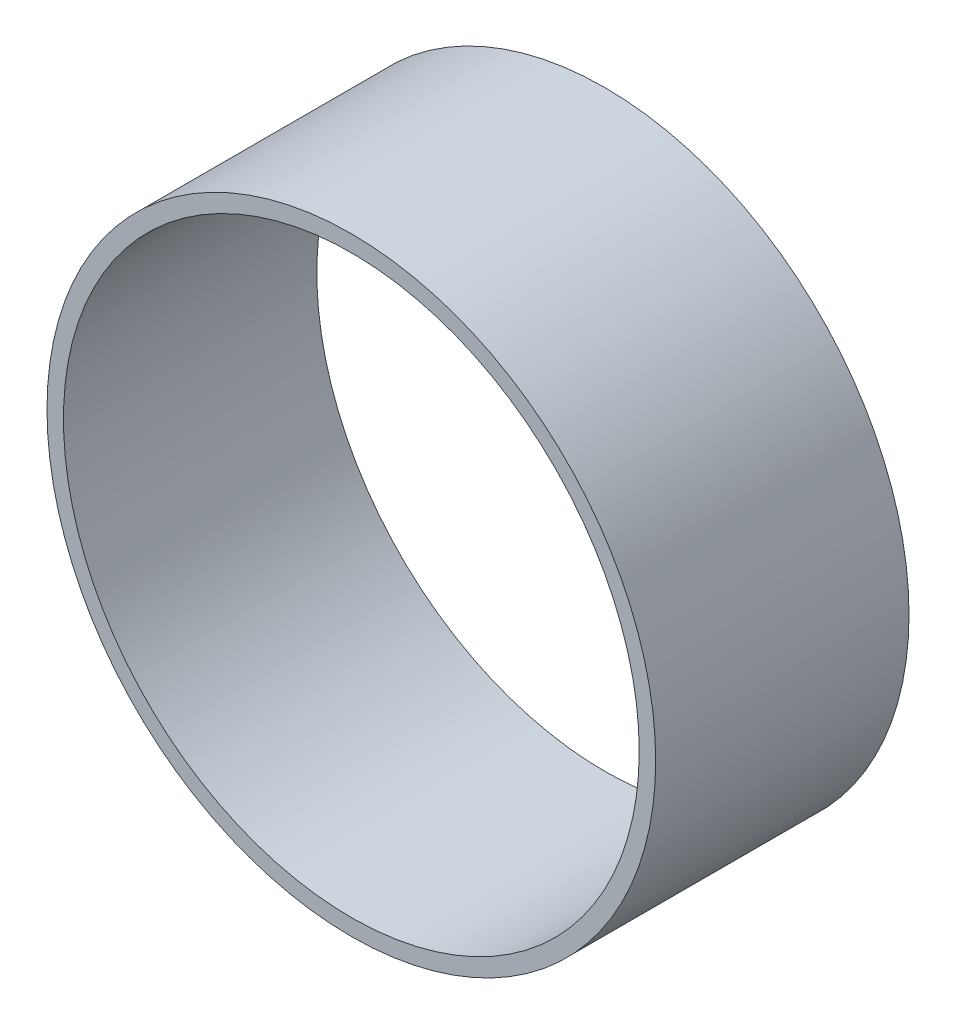
ISO-10303-21;
HEADER;
FILE_DESCRIPTION(('STEP AP214'),'2;1');
FILE_NAME('part.step','',(''),(''),'','','');
FILE_SCHEMA(('AUTOMOTIVE_DESIGN { 1 0 10303 214 1 1 1 1 }'));
ENDSEC;
DATA;
#1=APPLICATION_CONTEXT('core data for automotive mechanical design processes');
#2=APPLICATION_PROTOCOL_DEFINITION('international standard','automotive_design',2000,#1);
#3=PRODUCT_CONTEXT('',#1,'mechanical');
#4=PRODUCT('Part','Part','',(#3));
#5=PRODUCT_RELATED_PRODUCT_CATEGORY('part','',(#4));
#6=PRODUCT_DEFINITION_FORMATION('','',#4);
#7=PRODUCT_DEFINITION_CONTEXT('part definition',#1,'design');
#8=PRODUCT_DEFINITION('design','',#6,#7);
#9=PRODUCT_DEFINITION_SHAPE('','',#8);
#10=(LENGTH_UNIT() NAMED_UNIT(*) SI_UNIT(.MILLI.,.METRE.));
#11=(NAMED_UNIT(*) PLANE_ANGLE_UNIT() SI_UNIT($,.RADIAN.));
#12=(NAMED_UNIT(*) SI_UNIT($,.STERADIAN.) SOLID_ANGLE_UNIT());
#13=UNCERTAINTY_MEASURE_WITH_UNIT(LENGTH_MEASURE(1.E-05),#10,'distance_accuracy_value','');
#14=(GEOMETRIC_REPRESENTATION_CONTEXT(3) GLOBAL_UNCERTAINTY_ASSIGNED_CONTEXT((#13)) GLOBAL_UNIT_ASSIGNED_CONTEXT((#10,
#11,#12)) REPRESENTATION_CONTEXT('',''));
#15=CARTESIAN_POINT('',(0.,0.,0.));
#16=DIRECTION('',(0.,0.,1.));
#17=DIRECTION('',(1.,0.,0.));
#18=AXIS2_PLACEMENT_3D('',#15,#16,#17);
#19=CARTESIAN_POINT('',(0.,0.,0.));
#20=DIRECTION('',(0.,0.,-1.));
#21=DIRECTION('',(1.,0.,0.));
#22=AXIS2_PLACEMENT_3D('',#19,#20,#21);
#23=CYLINDRICAL_SURFACE('',#22,0.4699);
#24=CARTESIAN_POINT('',(0.,0.,0.39116));
#25=DIRECTION('',(0.,0.,1.));
#26=DIRECTION('',(1.,0.,0.));
#27=AXIS2_PLACEMENT_3D('',#24,#25,#26);
#28=CIRCLE('',#27,0.4699);
#29=CARTESIAN_POINT('',(0.4699,0.,0.39116));
#30=VERTEX_POINT('',#29);
#31=EDGE_CURVE('E11',#30,#30,#28,.T.);
#32=ORIENTED_EDGE('',*,*,#31,.F.);
#33=DIRECTION('',(0.,0.,1.));
#34=VECTOR('',#33,1.);
#35=CARTESIAN_POINT('',(0.4699,0.,0.));
#36=LINE('',#35,#34);
#37=CARTESIAN_POINT('',(0.4699,0.,0.));
#38=VERTEX_POINT('',#37);
#39=EDGE_CURVE('E23',#38,#30,#36,.T.);
#40=ORIENTED_EDGE('',*,*,#39,.F.);
#41=CARTESIAN_POINT('',(0.,0.,0.));
#42=DIRECTION('',(0.,0.,1.));
#43=DIRECTION('',(1.,0.,0.));
#44=AXIS2_PLACEMENT_3D('',#41,#42,#43);
#45=CIRCLE('',#44,0.4699);
#46=EDGE_CURVE('E45',#38,#38,#45,.T.);
#47=ORIENTED_EDGE('',*,*,#46,.T.);
#48=ORIENTED_EDGE('',*,*,#39,.T.);
#49=EDGE_LOOP('',(#32,#40,#47,#48));
#50=FACE_BOUND('',#49,.T.);
#51=ADVANCED_FACE('F16',(#50),#23,.T.);
#52=CARTESIAN_POINT('',(0.,0.,0.));
#53=DIRECTION('',(0.,0.,-1.));
#54=DIRECTION('',(1.,0.,0.));
#55=AXIS2_PLACEMENT_3D('',#52,#53,#54);
#56=CYLINDRICAL_SURFACE('',#55,0.4445);
#57=DIRECTION('',(0.,0.,1.));
#58=VECTOR('',#57,1.);
#59=CARTESIAN_POINT('',(0.4445,0.,0.));
#60=LINE('',#59,#58);
#61=CARTESIAN_POINT('',(0.4445,0.,0.));
#62=VERTEX_POINT('',#61);
#63=CARTESIAN_POINT('',(0.4445,0.,0.39116));
#64=VERTEX_POINT('',#63);
#65=EDGE_CURVE('E39',#62,#64,#60,.T.);
#66=ORIENTED_EDGE('',*,*,#65,.T.);
#67=CARTESIAN_POINT('',(0.,0.,0.39116));
#68=DIRECTION('',(0.,0.,1.));
#69=DIRECTION('',(1.,0.,0.));
#70=AXIS2_PLACEMENT_3D('',#67,#68,#69);
#71=CIRCLE('',#70,0.4445);
#72=EDGE_CURVE('E44',#64,#64,#71,.T.);
#73=ORIENTED_EDGE('',*,*,#72,.T.);
#74=ORIENTED_EDGE('',*,*,#65,.F.);
#75=CARTESIAN_POINT('',(0.,0.,0.));
#76=DIRECTION('',(0.,0.,1.));
#77=DIRECTION('',(1.,0.,0.));
#78=AXIS2_PLACEMENT_3D('',#75,#76,#77);
#79=CIRCLE('',#78,0.4445);
#80=EDGE_CURVE('E42',#62,#62,#79,.T.);
#81=ORIENTED_EDGE('',*,*,#80,.F.);
#82=EDGE_LOOP('',(#66,#73,#74,#81));
#83=FACE_BOUND('',#82,.T.);
#84=ADVANCED_FACE('F41',(#83),#56,.F.);
#85=CARTESIAN_POINT('',(0.,0.,0.));
#86=DIRECTION('',(0.,0.,1.));
#87=DIRECTION('',(1.,0.,0.));
#88=AXIS2_PLACEMENT_3D('',#85,#86,#87);
#89=PLANE('',#88);
#90=ORIENTED_EDGE('',*,*,#46,.F.);
#91=EDGE_LOOP('',(#90));
#92=FACE_BOUND('',#91,.T.);
#93=ORIENTED_EDGE('',*,*,#80,.T.);
#94=EDGE_LOOP('',(#93));
#95=FACE_BOUND('',#94,.T.);
#96=ADVANCED_FACE('F48',(#92,#95),#89,.F.);
#97=CARTESIAN_POINT('',(0.,0.,0.39116));
#98=DIRECTION('',(0.,0.,1.));
#99=DIRECTION('',(1.,0.,0.));
#100=AXIS2_PLACEMENT_3D('',#97,#98,#99);
#101=PLANE('',#100);
#102=ORIENTED_EDGE('',*,*,#31,.T.);
#103=EDGE_LOOP('',(#102));
#104=FACE_BOUND('',#103,.T.);
#105=ORIENTED_EDGE('',*,*,#72,.F.);
#106=EDGE_LOOP('',(#105));
#107=FACE_BOUND('',#106,.T.);
#108=ADVANCED_FACE('F55',(#104,#107),#101,.T.);
#109=CLOSED_SHELL('',(#51,#84,#96,#108));
#110=MANIFOLD_SOLID_BREP('B1',#109);
#111=ADVANCED_BREP_SHAPE_REPRESENTATION('',(#18,#110),#14);
#112=SHAPE_DEFINITION_REPRESENTATION(#9,#111);
ENDSEC;
END-ISO-10303-21;
